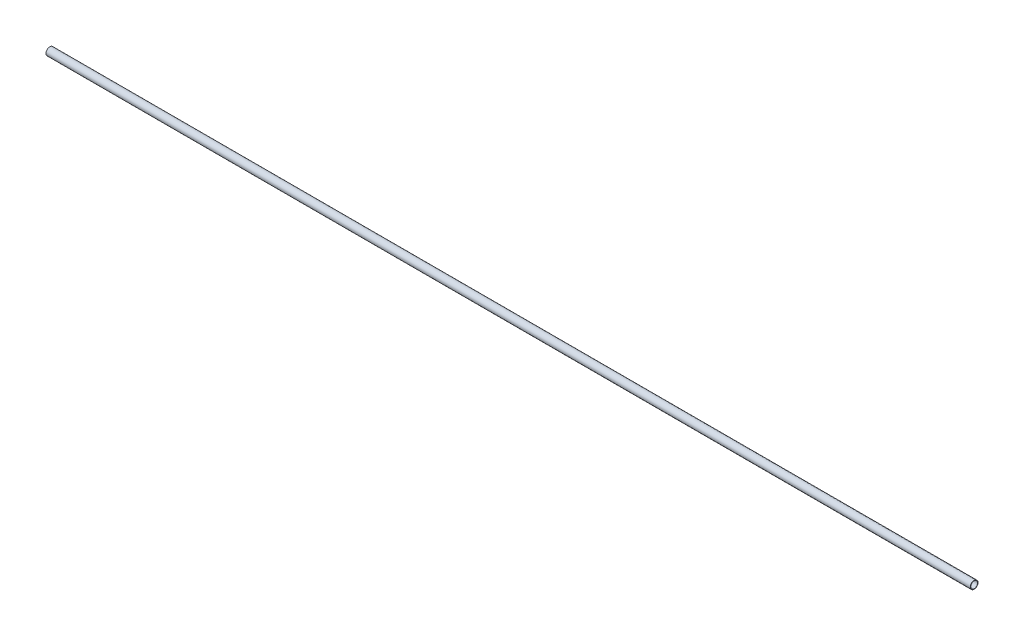
ISO-10303-21;
HEADER;
FILE_DESCRIPTION(('STEP AP214'),'2;1');
FILE_NAME('part.step','',(''),(''),'','','');
FILE_SCHEMA(('AUTOMOTIVE_DESIGN { 1 0 10303 214 1 1 1 1 }'));
ENDSEC;
DATA;
#1=APPLICATION_CONTEXT('core data for automotive mechanical design processes');
#2=APPLICATION_PROTOCOL_DEFINITION('international standard','automotive_design',2000,#1);
#3=PRODUCT_CONTEXT('',#1,'mechanical');
#4=PRODUCT('Part','Part','',(#3));
#5=PRODUCT_RELATED_PRODUCT_CATEGORY('part','',(#4));
#6=PRODUCT_DEFINITION_FORMATION('','',#4);
#7=PRODUCT_DEFINITION_CONTEXT('part definition',#1,'design');
#8=PRODUCT_DEFINITION('design','',#6,#7);
#9=PRODUCT_DEFINITION_SHAPE('','',#8);
#10=(LENGTH_UNIT() NAMED_UNIT(*) SI_UNIT(.MILLI.,.METRE.));
#11=(NAMED_UNIT(*) PLANE_ANGLE_UNIT() SI_UNIT($,.RADIAN.));
#12=(NAMED_UNIT(*) SI_UNIT($,.STERADIAN.) SOLID_ANGLE_UNIT());
#13=UNCERTAINTY_MEASURE_WITH_UNIT(LENGTH_MEASURE(1.E-05),#10,'distance_accuracy_value','');
#14=(GEOMETRIC_REPRESENTATION_CONTEXT(3) GLOBAL_UNCERTAINTY_ASSIGNED_CONTEXT((#13)) GLOBAL_UNIT_ASSIGNED_CONTEXT((#10,
#11,#12)) REPRESENTATION_CONTEXT('',''));
#15=CARTESIAN_POINT('',(0.,0.,0.));
#16=DIRECTION('',(0.,0.,1.));
#17=DIRECTION('',(1.,0.,0.));
#18=AXIS2_PLACEMENT_3D('',#15,#16,#17);
#19=CARTESIAN_POINT('',(762.,0.,0.));
#20=DIRECTION('',(1.,0.,0.));
#21=DIRECTION('',(0.,0.,-1.));
#22=AXIS2_PLACEMENT_3D('',#19,#20,#21);
#23=PLANE('',#22);
#24=CARTESIAN_POINT('',(762.,0.,0.));
#25=DIRECTION('',(1.,0.,0.));
#26=DIRECTION('',(0.,0.,-1.));
#27=AXIS2_PLACEMENT_3D('',#24,#25,#26);
#28=CIRCLE('',#27,6.35);
#29=CARTESIAN_POINT('',(762.,0.,-6.35));
#30=VERTEX_POINT('',#29);
#31=EDGE_CURVE('E10',#30,#30,#28,.T.);
#32=ORIENTED_EDGE('',*,*,#31,.T.);
#33=EDGE_LOOP('',(#32));
#34=FACE_BOUND('',#33,.T.);
#35=CARTESIAN_POINT('',(762.,0.,0.));
#36=DIRECTION('',(1.,0.,0.));
#37=DIRECTION('',(0.,0.,-1.));
#38=AXIS2_PLACEMENT_3D('',#35,#36,#37);
#39=CIRCLE('',#38,5.6388);
#40=CARTESIAN_POINT('',(762.,0.,-5.6388));
#41=VERTEX_POINT('',#40);
#42=EDGE_CURVE('E50',#41,#41,#39,.T.);
#43=ORIENTED_EDGE('',*,*,#42,.F.);
#44=EDGE_LOOP('',(#43));
#45=FACE_BOUND('',#44,.T.);
#46=ADVANCED_FACE('F37',(#34,#45),#23,.T.);
#47=CARTESIAN_POINT('',(-762.,0.,0.));
#48=DIRECTION('',(1.,0.,0.));
#49=DIRECTION('',(0.,0.,-1.));
#50=AXIS2_PLACEMENT_3D('',#47,#48,#49);
#51=PLANE('',#50);
#52=CARTESIAN_POINT('',(-762.,0.,0.));
#53=DIRECTION('',(1.,0.,0.));
#54=DIRECTION('',(0.,0.,-1.));
#55=AXIS2_PLACEMENT_3D('',#52,#53,#54);
#56=CIRCLE('',#55,6.35);
#57=CARTESIAN_POINT('',(-762.,0.,-6.35));
#58=VERTEX_POINT('',#57);
#59=EDGE_CURVE('E41',#58,#58,#56,.T.);
#60=ORIENTED_EDGE('',*,*,#59,.F.);
#61=EDGE_LOOP('',(#60));
#62=FACE_BOUND('',#61,.T.);
#63=CARTESIAN_POINT('',(-762.,0.,0.));
#64=DIRECTION('',(1.,0.,0.));
#65=DIRECTION('',(0.,0.,-1.));
#66=AXIS2_PLACEMENT_3D('',#63,#64,#65);
#67=CIRCLE('',#66,5.6388);
#68=CARTESIAN_POINT('',(-762.,0.,-5.6388));
#69=VERTEX_POINT('',#68);
#70=EDGE_CURVE('E52',#69,#69,#67,.T.);
#71=ORIENTED_EDGE('',*,*,#70,.T.);
#72=EDGE_LOOP('',(#71));
#73=FACE_BOUND('',#72,.T.);
#74=ADVANCED_FACE('F62',(#62,#73),#51,.F.);
#75=CARTESIAN_POINT('',(762.,0.,0.));
#76=DIRECTION('',(-1.,0.,0.));
#77=DIRECTION('',(0.,0.,1.));
#78=AXIS2_PLACEMENT_3D('',#75,#76,#77);
#79=CYLINDRICAL_SURFACE('',#78,6.35);
#80=ORIENTED_EDGE('',*,*,#31,.F.);
#81=EDGE_LOOP('',(#80));
#82=FACE_BOUND('',#81,.T.);
#83=ORIENTED_EDGE('',*,*,#59,.T.);
#84=EDGE_LOOP('',(#83));
#85=FACE_BOUND('',#84,.T.);
#86=ADVANCED_FACE('F39',(#82,#85),#79,.T.);
#87=CARTESIAN_POINT('',(762.,0.,0.));
#88=DIRECTION('',(-1.,0.,0.));
#89=DIRECTION('',(0.,0.,1.));
#90=AXIS2_PLACEMENT_3D('',#87,#88,#89);
#91=CYLINDRICAL_SURFACE('',#90,5.6388);
#92=ORIENTED_EDGE('',*,*,#42,.T.);
#93=EDGE_LOOP('',(#92));
#94=FACE_BOUND('',#93,.T.);
#95=ORIENTED_EDGE('',*,*,#70,.F.);
#96=EDGE_LOOP('',(#95));
#97=FACE_BOUND('',#96,.T.);
#98=ADVANCED_FACE('F58',(#94,#97),#91,.F.);
#99=CLOSED_SHELL('',(#46,#74,#86,#98));
#100=MANIFOLD_SOLID_BREP('B2',#99);
#101=ADVANCED_BREP_SHAPE_REPRESENTATION('',(#18,#100),#14);
#102=SHAPE_DEFINITION_REPRESENTATION(#9,#101);
ENDSEC;
END-ISO-10303-21;
